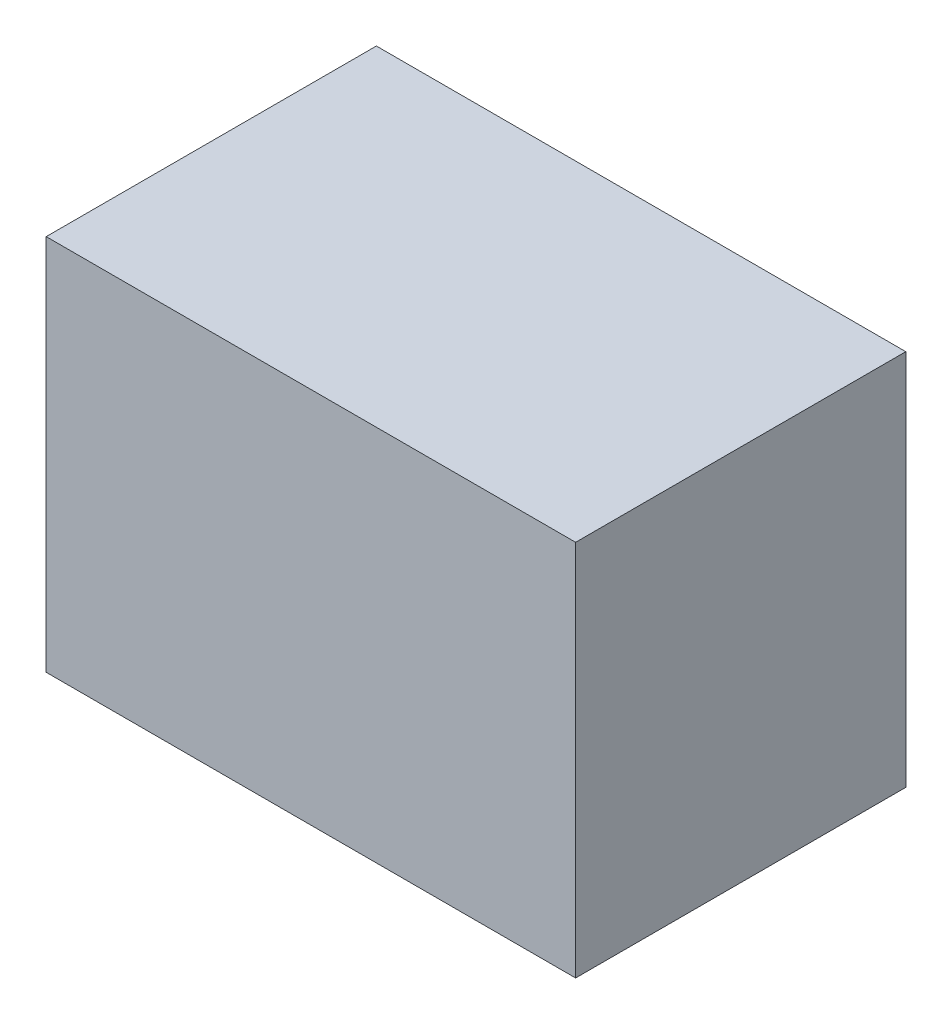
ISO-10303-21;
HEADER;
FILE_DESCRIPTION(('STEP AP214'),'2;1');
FILE_NAME('part.step','',(''),(''),'','','');
FILE_SCHEMA(('AUTOMOTIVE_DESIGN { 1 0 10303 214 1 1 1 1 }'));
ENDSEC;
DATA;
#1=APPLICATION_CONTEXT('core data for automotive mechanical design processes');
#2=APPLICATION_PROTOCOL_DEFINITION('international standard','automotive_design',2000,#1);
#3=PRODUCT_CONTEXT('',#1,'mechanical');
#4=PRODUCT('Part','Part','',(#3));
#5=PRODUCT_RELATED_PRODUCT_CATEGORY('part','',(#4));
#6=PRODUCT_DEFINITION_FORMATION('','',#4);
#7=PRODUCT_DEFINITION_CONTEXT('part definition',#1,'design');
#8=PRODUCT_DEFINITION('design','',#6,#7);
#9=PRODUCT_DEFINITION_SHAPE('','',#8);
#10=(LENGTH_UNIT() NAMED_UNIT(*) SI_UNIT(.MILLI.,.METRE.));
#11=(NAMED_UNIT(*) PLANE_ANGLE_UNIT() SI_UNIT($,.RADIAN.));
#12=(NAMED_UNIT(*) SI_UNIT($,.STERADIAN.) SOLID_ANGLE_UNIT());
#13=UNCERTAINTY_MEASURE_WITH_UNIT(LENGTH_MEASURE(1.E-05),#10,'distance_accuracy_value','');
#14=(GEOMETRIC_REPRESENTATION_CONTEXT(3) GLOBAL_UNCERTAINTY_ASSIGNED_CONTEXT((#13)) GLOBAL_UNIT_ASSIGNED_CONTEXT((#10,
#11,#12)) REPRESENTATION_CONTEXT('',''));
#15=CARTESIAN_POINT('',(0.,0.,0.));
#16=DIRECTION('',(0.,0.,1.));
#17=DIRECTION('',(1.,0.,0.));
#18=AXIS2_PLACEMENT_3D('',#15,#16,#17);
#19=CARTESIAN_POINT('',(-1.1,-0.784,1.386));
#20=DIRECTION('',(0.,0.,1.));
#21=DIRECTION('',(1.,0.,0.));
#22=AXIS2_PLACEMENT_3D('',#19,#20,#21);
#23=PLANE('',#22);
#24=DIRECTION('',(0.,1.,0.));
#25=VECTOR('',#24,1.);
#26=CARTESIAN_POINT('',(1.1,-0.784,1.386));
#27=LINE('',#26,#25);
#28=CARTESIAN_POINT('',(1.1,0.784,1.386));
#29=VERTEX_POINT('',#28);
#30=CARTESIAN_POINT('',(1.1,-0.784,1.386));
#31=VERTEX_POINT('',#30);
#32=EDGE_CURVE('E76',#29,#31,#27,.F.);
#33=ORIENTED_EDGE('',*,*,#32,.F.);
#34=DIRECTION('',(1.,0.,0.));
#35=VECTOR('',#34,1.);
#36=CARTESIAN_POINT('',(-1.1,0.784,1.386));
#37=LINE('',#36,#35);
#38=CARTESIAN_POINT('',(-1.1,0.784,1.386));
#39=VERTEX_POINT('',#38);
#40=EDGE_CURVE('E58',#39,#29,#37,.T.);
#41=ORIENTED_EDGE('',*,*,#40,.F.);
#42=DIRECTION('',(0.,1.,0.));
#43=VECTOR('',#42,1.);
#44=CARTESIAN_POINT('',(-1.1,-0.784,1.386));
#45=LINE('',#44,#43);
#46=CARTESIAN_POINT('',(-1.1,-0.784,1.386));
#47=VERTEX_POINT('',#46);
#48=EDGE_CURVE('E20',#39,#47,#45,.F.);
#49=ORIENTED_EDGE('',*,*,#48,.T.);
#50=DIRECTION('',(1.,0.,0.));
#51=VECTOR('',#50,1.);
#52=CARTESIAN_POINT('',(-1.1,-0.784,1.386));
#53=LINE('',#52,#51);
#54=EDGE_CURVE('E55',#47,#31,#53,.T.);
#55=ORIENTED_EDGE('',*,*,#54,.T.);
#56=EDGE_LOOP('',(#33,#41,#49,#55));
#57=FACE_BOUND('',#56,.T.);
#58=ADVANCED_FACE('F17',(#57),#23,.T.);
#59=CARTESIAN_POINT('',(-1.1,-0.784,0.014));
#60=DIRECTION('',(1.,0.,0.));
#61=DIRECTION('',(0.,0.,-1.));
#62=AXIS2_PLACEMENT_3D('',#59,#60,#61);
#63=PLANE('',#62);
#64=DIRECTION('',(0.,0.,1.));
#65=VECTOR('',#64,1.);
#66=CARTESIAN_POINT('',(-1.1,0.784,0.014));
#67=LINE('',#66,#65);
#68=CARTESIAN_POINT('',(-1.1,0.784,0.014));
#69=VERTEX_POINT('',#68);
#70=EDGE_CURVE('E78',#69,#39,#67,.T.);
#71=ORIENTED_EDGE('',*,*,#70,.F.);
#72=DIRECTION('',(0.,1.,0.));
#73=VECTOR('',#72,1.);
#74=CARTESIAN_POINT('',(-1.1,-0.784,0.014));
#75=LINE('',#74,#73);
#76=CARTESIAN_POINT('',(-1.1,-0.784,0.014));
#77=VERTEX_POINT('',#76);
#78=EDGE_CURVE('E73',#69,#77,#75,.F.);
#79=ORIENTED_EDGE('',*,*,#78,.T.);
#80=DIRECTION('',(0.,0.,1.));
#81=VECTOR('',#80,1.);
#82=CARTESIAN_POINT('',(-1.1,-0.784,0.014));
#83=LINE('',#82,#81);
#84=EDGE_CURVE('E63',#77,#47,#83,.T.);
#85=ORIENTED_EDGE('',*,*,#84,.T.);
#86=ORIENTED_EDGE('',*,*,#48,.F.);
#87=EDGE_LOOP('',(#71,#79,#85,#86));
#88=FACE_BOUND('',#87,.T.);
#89=ADVANCED_FACE('F72',(#88),#63,.F.);
#90=CARTESIAN_POINT('',(-1.1,-0.784,0.014));
#91=DIRECTION('',(0.,1.,0.));
#92=DIRECTION('',(0.,0.,1.));
#93=AXIS2_PLACEMENT_3D('',#90,#91,#92);
#94=PLANE('',#93);
#95=ORIENTED_EDGE('',*,*,#54,.F.);
#96=ORIENTED_EDGE('',*,*,#84,.F.);
#97=DIRECTION('',(1.,0.,0.));
#98=VECTOR('',#97,1.);
#99=CARTESIAN_POINT('',(-1.1,-0.784,0.014));
#100=LINE('',#99,#98);
#101=CARTESIAN_POINT('',(1.1,-0.784,0.014));
#102=VERTEX_POINT('',#101);
#103=EDGE_CURVE('E83',#77,#102,#100,.T.);
#104=ORIENTED_EDGE('',*,*,#103,.T.);
#105=DIRECTION('',(0.,0.,-1.));
#106=VECTOR('',#105,1.);
#107=CARTESIAN_POINT('',(1.1,-0.784,0.014));
#108=LINE('',#107,#106);
#109=EDGE_CURVE('E69',#31,#102,#108,.T.);
#110=ORIENTED_EDGE('',*,*,#109,.F.);
#111=EDGE_LOOP('',(#95,#96,#104,#110));
#112=FACE_BOUND('',#111,.T.);
#113=ADVANCED_FACE('F66',(#112),#94,.F.);
#114=CARTESIAN_POINT('',(1.1,-0.784,0.014));
#115=DIRECTION('',(1.,0.,0.));
#116=DIRECTION('',(0.,0.,-1.));
#117=AXIS2_PLACEMENT_3D('',#114,#115,#116);
#118=PLANE('',#117);
#119=DIRECTION('',(0.,0.,1.));
#120=VECTOR('',#119,1.);
#121=CARTESIAN_POINT('',(1.1,0.784,0.014));
#122=LINE('',#121,#120);
#123=CARTESIAN_POINT('',(1.1,0.784,0.014));
#124=VERTEX_POINT('',#123);
#125=EDGE_CURVE('E34',#29,#124,#122,.F.);
#126=ORIENTED_EDGE('',*,*,#125,.F.);
#127=ORIENTED_EDGE('',*,*,#32,.T.);
#128=ORIENTED_EDGE('',*,*,#109,.T.);
#129=DIRECTION('',(0.,1.,0.));
#130=VECTOR('',#129,1.);
#131=CARTESIAN_POINT('',(1.1,-0.784,0.014));
#132=LINE('',#131,#130);
#133=EDGE_CURVE('E26',#102,#124,#132,.T.);
#134=ORIENTED_EDGE('',*,*,#133,.T.);
#135=EDGE_LOOP('',(#126,#127,#128,#134));
#136=FACE_BOUND('',#135,.T.);
#137=ADVANCED_FACE('F88',(#136),#118,.T.);
#138=CARTESIAN_POINT('',(-1.1,0.784,0.014));
#139=DIRECTION('',(0.,1.,0.));
#140=DIRECTION('',(0.,0.,1.));
#141=AXIS2_PLACEMENT_3D('',#138,#139,#140);
#142=PLANE('',#141);
#143=ORIENTED_EDGE('',*,*,#40,.T.);
#144=ORIENTED_EDGE('',*,*,#125,.T.);
#145=DIRECTION('',(1.,0.,0.));
#146=VECTOR('',#145,1.);
#147=CARTESIAN_POINT('',(-1.1,0.784,0.014));
#148=LINE('',#147,#146);
#149=EDGE_CURVE('E11',#124,#69,#148,.F.);
#150=ORIENTED_EDGE('',*,*,#149,.T.);
#151=ORIENTED_EDGE('',*,*,#70,.T.);
#152=EDGE_LOOP('',(#143,#144,#150,#151));
#153=FACE_BOUND('',#152,.T.);
#154=ADVANCED_FACE('F91',(#153),#142,.T.);
#155=CARTESIAN_POINT('',(-1.1,-0.784,0.014));
#156=DIRECTION('',(0.,0.,1.));
#157=DIRECTION('',(1.,0.,0.));
#158=AXIS2_PLACEMENT_3D('',#155,#156,#157);
#159=PLANE('',#158);
#160=ORIENTED_EDGE('',*,*,#133,.F.);
#161=ORIENTED_EDGE('',*,*,#103,.F.);
#162=ORIENTED_EDGE('',*,*,#78,.F.);
#163=ORIENTED_EDGE('',*,*,#149,.F.);
#164=EDGE_LOOP('',(#160,#161,#162,#163));
#165=FACE_BOUND('',#164,.T.);
#166=ADVANCED_FACE('F90',(#165),#159,.F.);
#167=CLOSED_SHELL('',(#58,#89,#113,#137,#154,#166));
#168=MANIFOLD_SOLID_BREP('B1',#167);
#169=ADVANCED_BREP_SHAPE_REPRESENTATION('',(#18,#168),#14);
#170=SHAPE_DEFINITION_REPRESENTATION(#9,#169);
ENDSEC;
END-ISO-10303-21;
